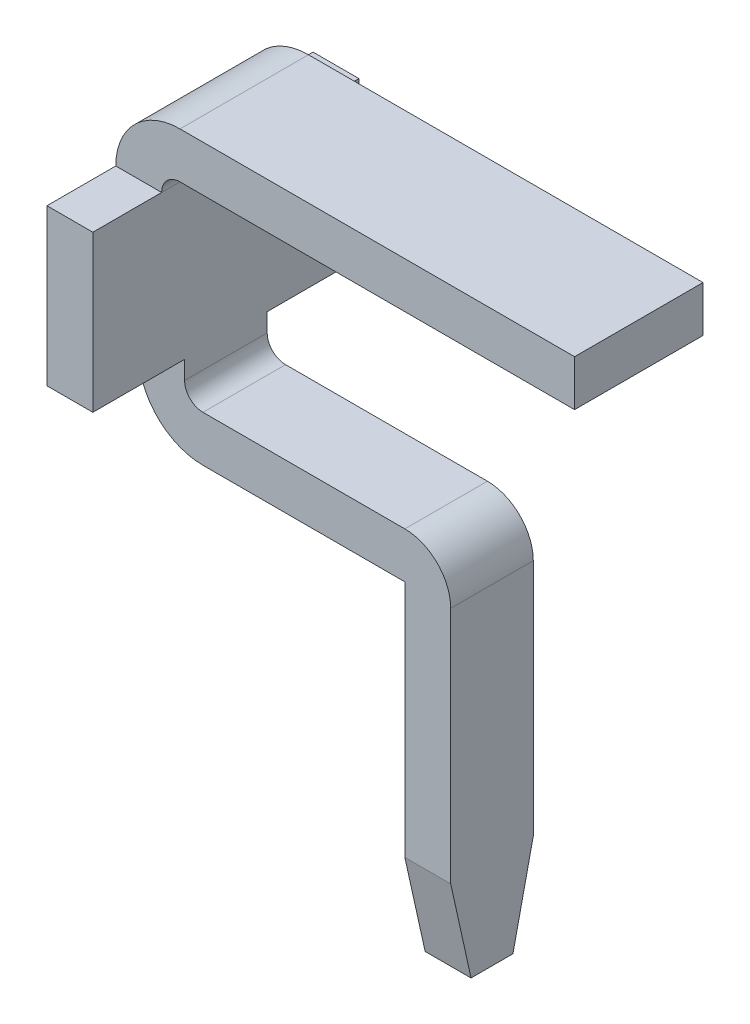
ISO-10303-21;
HEADER;
FILE_DESCRIPTION(('STEP AP214'),'2;1');
FILE_NAME('part.step','',(''),(''),'','','');
FILE_SCHEMA(('AUTOMOTIVE_DESIGN { 1 0 10303 214 1 1 1 1 }'));
ENDSEC;
DATA;
#1=APPLICATION_CONTEXT('core data for automotive mechanical design processes');
#2=APPLICATION_PROTOCOL_DEFINITION('international standard','automotive_design',2000,#1);
#3=PRODUCT_CONTEXT('',#1,'mechanical');
#4=PRODUCT('Part','Part','',(#3));
#5=PRODUCT_RELATED_PRODUCT_CATEGORY('part','',(#4));
#6=PRODUCT_DEFINITION_FORMATION('','',#4);
#7=PRODUCT_DEFINITION_CONTEXT('part definition',#1,'design');
#8=PRODUCT_DEFINITION('design','',#6,#7);
#9=PRODUCT_DEFINITION_SHAPE('','',#8);
#10=(LENGTH_UNIT() NAMED_UNIT(*) SI_UNIT(.MILLI.,.METRE.));
#11=(NAMED_UNIT(*) PLANE_ANGLE_UNIT() SI_UNIT($,.RADIAN.));
#12=(NAMED_UNIT(*) SI_UNIT($,.STERADIAN.) SOLID_ANGLE_UNIT());
#13=UNCERTAINTY_MEASURE_WITH_UNIT(LENGTH_MEASURE(1.E-05),#10,'distance_accuracy_value','');
#14=(GEOMETRIC_REPRESENTATION_CONTEXT(3) GLOBAL_UNCERTAINTY_ASSIGNED_CONTEXT((#13)) GLOBAL_UNIT_ASSIGNED_CONTEXT((#10,
#11,#12)) REPRESENTATION_CONTEXT('',''));
#15=CARTESIAN_POINT('',(0.,0.,0.));
#16=DIRECTION('',(0.,0.,1.));
#17=DIRECTION('',(1.,0.,0.));
#18=AXIS2_PLACEMENT_3D('',#15,#16,#17);
#19=CARTESIAN_POINT('',(17.905055780802,28.974554183552,-0.357117525004));
#20=DIRECTION('',(0.,0.216439613937991,0.976296007119958));
#21=DIRECTION('',(0.,-0.976296007119958,0.216439613937991));
#22=AXIS2_PLACEMENT_3D('',#19,#20,#21);
#23=PLANE('',#22);
#24=DIRECTION('',(1.,0.,0.));
#25=VECTOR('',#24,1.);
#26=CARTESIAN_POINT('',(17.905055780802,27.974554183552,-0.135422862361));
#27=LINE('',#26,#25);
#28=CARTESIAN_POINT('',(15.780053380802,27.974554183552,-0.135422862361));
#29=VERTEX_POINT('',#28);
#30=CARTESIAN_POINT('',(15.280053380802,27.974554183552,-0.135422862361));
#31=VERTEX_POINT('',#30);
#32=EDGE_CURVE('E123',#29,#31,#27,.F.);
#33=ORIENTED_EDGE('',*,*,#32,.T.);
#34=DIRECTION('',(0.,-0.976296007119921,0.216439613938159));
#35=VECTOR('',#34,1.);
#36=CARTESIAN_POINT('',(15.280053380802,28.974554183552,-0.357117525004));
#37=LINE('',#36,#35);
#38=CARTESIAN_POINT('',(15.280053380802,28.974554183552,-0.357117525004));
#39=VERTEX_POINT('',#38);
#40=EDGE_CURVE('E206',#39,#31,#37,.T.);
#41=ORIENTED_EDGE('',*,*,#40,.F.);
#42=DIRECTION('',(1.,0.,0.));
#43=VECTOR('',#42,1.);
#44=CARTESIAN_POINT('',(17.905055780802,28.974554183552,-0.357117525004));
#45=LINE('',#44,#43);
#46=CARTESIAN_POINT('',(15.780053380802,28.974554183552,-0.357117525004));
#47=VERTEX_POINT('',#46);
#48=EDGE_CURVE('E137',#39,#47,#45,.T.);
#49=ORIENTED_EDGE('',*,*,#48,.T.);
#50=DIRECTION('',(0.,0.976296007119921,-0.216439613938159));
#51=VECTOR('',#50,1.);
#52=CARTESIAN_POINT('',(15.780053380802,27.974554183552,-0.135422862361));
#53=LINE('',#52,#51);
#54=EDGE_CURVE('E231',#29,#47,#53,.T.);
#55=ORIENTED_EDGE('',*,*,#54,.F.);
#56=EDGE_LOOP('',(#33,#41,#49,#55));
#57=FACE_BOUND('',#56,.T.);
#58=ADVANCED_FACE('F17',(#57),#23,.F.);
#59=CARTESIAN_POINT('',(17.905055780802,27.974554183552,-0.135422862361));
#60=DIRECTION('',(0.,1.,0.));
#61=DIRECTION('',(0.,0.,1.));
#62=AXIS2_PLACEMENT_3D('',#59,#60,#61);
#63=PLANE('',#62);
#64=DIRECTION('',(1.,0.,0.));
#65=VECTOR('',#64,1.);
#66=CARTESIAN_POINT('',(17.905055780802,27.974554183552,0.321187812353));
#67=LINE('',#66,#65);
#68=CARTESIAN_POINT('',(15.780053380802,27.974554183552,0.321187812353));
#69=VERTEX_POINT('',#68);
#70=CARTESIAN_POINT('',(15.280053380802,27.974554183552,0.321187812353));
#71=VERTEX_POINT('',#70);
#72=EDGE_CURVE('E213',#69,#71,#67,.F.);
#73=ORIENTED_EDGE('',*,*,#72,.T.);
#74=DIRECTION('',(0.,0.,1.));
#75=VECTOR('',#74,1.);
#76=CARTESIAN_POINT('',(15.280053380802,27.974554183552,0.09381247499561));
#77=LINE('',#76,#75);
#78=EDGE_CURVE('E209',#31,#71,#77,.T.);
#79=ORIENTED_EDGE('',*,*,#78,.F.);
#80=ORIENTED_EDGE('',*,*,#32,.F.);
#81=DIRECTION('',(0.,0.,-1.));
#82=VECTOR('',#81,1.);
#83=CARTESIAN_POINT('',(15.780053380802,27.974554183552,0.09381247499561));
#84=LINE('',#83,#82);
#85=EDGE_CURVE('E228',#69,#29,#84,.T.);
#86=ORIENTED_EDGE('',*,*,#85,.F.);
#87=EDGE_LOOP('',(#73,#79,#80,#86));
#88=FACE_BOUND('',#87,.T.);
#89=ADVANCED_FACE('F830',(#88),#63,.F.);
#90=CARTESIAN_POINT('',(17.905055780802,32.074554183552,-0.357117525004));
#91=DIRECTION('',(0.,0.,1.));
#92=DIRECTION('',(0.,-1.,0.));
#93=AXIS2_PLACEMENT_3D('',#90,#91,#92);
#94=PLANE('',#93);
#95=DIRECTION('',(0.,1.,0.));
#96=VECTOR('',#95,1.);
#97=CARTESIAN_POINT('',(15.780053380802,28.974554183552,-0.357117525004));
#98=LINE('',#97,#96);
#99=CARTESIAN_POINT('',(15.780053380802,31.574554183552,-0.357117525004));
#100=VERTEX_POINT('',#99);
#101=EDGE_CURVE('E234',#47,#100,#98,.T.);
#102=ORIENTED_EDGE('',*,*,#101,.F.);
#103=ORIENTED_EDGE('',*,*,#48,.F.);
#104=DIRECTION('',(0.,1.,0.));
#105=VECTOR('',#104,1.);
#106=CARTESIAN_POINT('',(15.280053380802,28.974554183552,-0.357117525004));
#107=LINE('',#106,#105);
#108=CARTESIAN_POINT('',(15.280053380802,31.574554183552,-0.357117525004));
#109=VERTEX_POINT('',#108);
#110=EDGE_CURVE('E398',#109,#39,#107,.F.);
#111=ORIENTED_EDGE('',*,*,#110,.F.);
#112=DIRECTION('',(1.,0.,0.));
#113=VECTOR('',#112,1.);
#114=CARTESIAN_POINT('',(13.080053380802,31.574554183552,-0.357117525004));
#115=LINE('',#114,#113);
#116=CARTESIAN_POINT('',(13.080053380802,31.574554183552,-0.357117525004));
#117=VERTEX_POINT('',#116);
#118=EDGE_CURVE('E388',#117,#109,#115,.T.);
#119=ORIENTED_EDGE('',*,*,#118,.F.);
#120=CARTESIAN_POINT('',(13.080053380802,32.274554183552,-0.357117525004));
#121=DIRECTION('',(0.,0.,-1.));
#122=DIRECTION('',(-1.,0.,0.));
#123=AXIS2_PLACEMENT_3D('',#120,#121,#122);
#124=CIRCLE('',#123,0.7);
#125=CARTESIAN_POINT('',(12.380053380802,32.274554183552,-0.357117525004));
#126=VERTEX_POINT('',#125);
#127=EDGE_CURVE('E140',#126,#117,#124,.F.);
#128=ORIENTED_EDGE('',*,*,#127,.F.);
#129=DIRECTION('',(0.,-1.,0.));
#130=VECTOR('',#129,1.);
#131=CARTESIAN_POINT('',(12.380053380802,32.074554183552,-0.357117525004));
#132=LINE('',#131,#130);
#133=CARTESIAN_POINT('',(12.380053380802,32.474554183552,-0.357117525004));
#134=VERTEX_POINT('',#133);
#135=EDGE_CURVE('E149',#134,#126,#132,.T.);
#136=ORIENTED_EDGE('',*,*,#135,.F.);
#137=DIRECTION('',(1.,0.,0.));
#138=VECTOR('',#137,1.);
#139=CARTESIAN_POINT('',(17.905055780802,32.474554183552,-0.357117525004));
#140=LINE('',#139,#138);
#141=CARTESIAN_POINT('',(12.880053380802,32.474554183552,-0.357117525004));
#142=VERTEX_POINT('',#141);
#143=EDGE_CURVE('E146',#142,#134,#140,.F.);
#144=ORIENTED_EDGE('',*,*,#143,.F.);
#145=DIRECTION('',(0.,-1.,0.));
#146=VECTOR('',#145,1.);
#147=CARTESIAN_POINT('',(12.880053380802,32.074554183552,-0.357117525004));
#148=LINE('',#147,#146);
#149=CARTESIAN_POINT('',(12.880053380802,32.274554183552,-0.357117525004));
#150=VERTEX_POINT('',#149);
#151=EDGE_CURVE('E119',#150,#142,#148,.F.);
#152=ORIENTED_EDGE('',*,*,#151,.F.);
#153=CARTESIAN_POINT('',(13.080053380802,32.274554183552,-0.357117525004));
#154=DIRECTION('',(0.,0.,-1.));
#155=DIRECTION('',(-1.,0.,0.));
#156=AXIS2_PLACEMENT_3D('',#153,#154,#155);
#157=CIRCLE('',#156,0.2);
#158=CARTESIAN_POINT('',(13.080053380802,32.074554183552,-0.357117525004));
#159=VERTEX_POINT('',#158);
#160=EDGE_CURVE('E20',#159,#150,#157,.T.);
#161=ORIENTED_EDGE('',*,*,#160,.F.);
#162=DIRECTION('',(1.,0.,0.));
#163=VECTOR('',#162,1.);
#164=CARTESIAN_POINT('',(13.080053380802,32.074554183552,-0.357117525004));
#165=LINE('',#164,#163);
#166=CARTESIAN_POINT('',(15.280053380802,32.074554183552,-0.357117525004));
#167=VERTEX_POINT('',#166);
#168=EDGE_CURVE('E115',#167,#159,#165,.F.);
#169=ORIENTED_EDGE('',*,*,#168,.F.);
#170=CARTESIAN_POINT('',(15.280053380802,31.574554183552,-0.357117525004));
#171=DIRECTION('',(0.,0.,-1.));
#172=DIRECTION('',(-1.,0.,0.));
#173=AXIS2_PLACEMENT_3D('',#170,#171,#172);
#174=CIRCLE('',#173,0.5);
#175=EDGE_CURVE('E131',#100,#167,#174,.F.);
#176=ORIENTED_EDGE('',*,*,#175,.F.);
#177=EDGE_LOOP('',(#102,#103,#111,#119,#128,#136,#144,#152,#161,#169,#176));
#178=FACE_BOUND('',#177,.T.);
#179=ADVANCED_FACE('F113',(#178),#94,.F.);
#180=CARTESIAN_POINT('',(12.180053380802,33.882322537269,0.0928824749956));
#181=DIRECTION('',(-1.,0.,0.));
#182=DIRECTION('',(0.,-1.,0.));
#183=AXIS2_PLACEMENT_3D('',#180,#181,#182);
#184=PLANE('',#183);
#185=DIRECTION('',(0.,0.,1.));
#186=VECTOR('',#185,1.);
#187=CARTESIAN_POINT('',(12.180053380802,33.674554183552,-0.314471957289));
#188=LINE('',#187,#186);
#189=CARTESIAN_POINT('',(12.180053380802,33.674554183552,-0.406187525004));
#190=VERTEX_POINT('',#189);
#191=CARTESIAN_POINT('',(12.180053380802,33.674554183552,0.593812474996));
#192=VERTEX_POINT('',#191);
#193=EDGE_CURVE('E372',#190,#192,#188,.T.);
#194=ORIENTED_EDGE('',*,*,#193,.F.);
#195=DIRECTION('',(0.,1.,0.));
#196=VECTOR('',#195,1.);
#197=CARTESIAN_POINT('',(12.180053380802,32.974554183552,-0.406187525004));
#198=LINE('',#197,#196);
#199=CARTESIAN_POINT('',(12.180053380802,32.974554183552,-0.406187525004));
#200=VERTEX_POINT('',#199);
#201=EDGE_CURVE('E377',#200,#190,#198,.T.);
#202=ORIENTED_EDGE('',*,*,#201,.F.);
#203=DIRECTION('',(0.,0.,1.));
#204=VECTOR('',#203,1.);
#205=CARTESIAN_POINT('',(12.180053380802,32.974554183552,0.50023690728));
#206=LINE('',#205,#204);
#207=CARTESIAN_POINT('',(12.180053380802,32.974554183552,0.593812474996));
#208=VERTEX_POINT('',#207);
#209=EDGE_CURVE('E382',#208,#200,#206,.F.);
#210=ORIENTED_EDGE('',*,*,#209,.F.);
#211=DIRECTION('',(0.,-1.,0.));
#212=VECTOR('',#211,1.);
#213=CARTESIAN_POINT('',(12.180053380802,33.590090890987,0.593812474996));
#214=LINE('',#213,#212);
#215=EDGE_CURVE('E366',#192,#208,#214,.T.);
#216=ORIENTED_EDGE('',*,*,#215,.F.);
#217=EDGE_LOOP('',(#194,#202,#210,#216));
#218=FACE_BOUND('',#217,.T.);
#219=ADVANCED_FACE('F814',(#218),#184,.T.);
#220=CARTESIAN_POINT('',(13.080053380802,32.074554183552,0.09381247499561));
#221=DIRECTION('',(0.,1.,0.));
#222=DIRECTION('',(0.,0.,1.));
#223=AXIS2_PLACEMENT_3D('',#220,#221,#222);
#224=PLANE('',#223);
#225=ORIENTED_EDGE('',*,*,#168,.T.);
#226=DIRECTION('',(0.,0.,1.));
#227=VECTOR('',#226,1.);
#228=CARTESIAN_POINT('',(13.080053380802,32.074554183552,0.09381247499561));
#229=LINE('',#228,#227);
#230=CARTESIAN_POINT('',(13.080053380802,32.074554183552,0.542882474996));
#231=VERTEX_POINT('',#230);
#232=EDGE_CURVE('E125',#159,#231,#229,.T.);
#233=ORIENTED_EDGE('',*,*,#232,.T.);
#234=DIRECTION('',(1.,0.,0.));
#235=VECTOR('',#234,1.);
#236=CARTESIAN_POINT('',(17.905055780802,32.074554183552,0.542882474996));
#237=LINE('',#236,#235);
#238=CARTESIAN_POINT('',(15.280053380802,32.074554183552,0.542882474996));
#239=VERTEX_POINT('',#238);
#240=EDGE_CURVE('E184',#231,#239,#237,.T.);
#241=ORIENTED_EDGE('',*,*,#240,.T.);
#242=DIRECTION('',(0.,0.,-1.));
#243=VECTOR('',#242,1.);
#244=CARTESIAN_POINT('',(15.280053380802,32.074554183552,0.09381247499561));
#245=LINE('',#244,#243);
#246=EDGE_CURVE('E135',#167,#239,#245,.F.);
#247=ORIENTED_EDGE('',*,*,#246,.F.);
#248=EDGE_LOOP('',(#225,#233,#241,#247));
#249=FACE_BOUND('',#248,.T.);
#250=ADVANCED_FACE('F133',(#249),#224,.T.);
#251=CARTESIAN_POINT('',(15.280053380802,31.574554183552,0.09381247499561));
#252=DIRECTION('',(0.,0.,-1.));
#253=DIRECTION('',(-1.,0.,0.));
#254=AXIS2_PLACEMENT_3D('',#251,#252,#253);
#255=CYLINDRICAL_SURFACE('',#254,0.5);
#256=CARTESIAN_POINT('',(15.280053380802,31.574554183552,0.542882474996));
#257=DIRECTION('',(0.,0.,-1.));
#258=DIRECTION('',(-1.,0.,0.));
#259=AXIS2_PLACEMENT_3D('',#256,#257,#258);
#260=CIRCLE('',#259,0.5);
#261=CARTESIAN_POINT('',(15.780053380802,31.574554183552,0.542882474996));
#262=VERTEX_POINT('',#261);
#263=EDGE_CURVE('E181',#239,#262,#260,.T.);
#264=ORIENTED_EDGE('',*,*,#263,.T.);
#265=DIRECTION('',(0.,0.,-1.));
#266=VECTOR('',#265,1.);
#267=CARTESIAN_POINT('',(15.780053380802,31.574554183552,0.09381247499561));
#268=LINE('',#267,#266);
#269=EDGE_CURVE('E216',#100,#262,#268,.F.);
#270=ORIENTED_EDGE('',*,*,#269,.F.);
#271=ORIENTED_EDGE('',*,*,#175,.T.);
#272=ORIENTED_EDGE('',*,*,#246,.T.);
#273=EDGE_LOOP('',(#264,#270,#271,#272));
#274=FACE_BOUND('',#273,.T.);
#275=ADVANCED_FACE('F419',(#274),#255,.T.);
#276=CARTESIAN_POINT('',(15.780053380802,28.974554183552,0.09381247499561));
#277=DIRECTION('',(1.,0.,0.));
#278=DIRECTION('',(0.,0.,-1.));
#279=AXIS2_PLACEMENT_3D('',#276,#277,#278);
#280=PLANE('',#279);
#281=ORIENTED_EDGE('',*,*,#101,.T.);
#282=ORIENTED_EDGE('',*,*,#269,.T.);
#283=DIRECTION('',(0.,1.,0.));
#284=VECTOR('',#283,1.);
#285=CARTESIAN_POINT('',(15.780053380802,32.074554183552,0.542882474996));
#286=LINE('',#285,#284);
#287=CARTESIAN_POINT('',(15.780053380802,28.974554183552,0.542882474995942));
#288=VERTEX_POINT('',#287);
#289=EDGE_CURVE('E183',#262,#288,#286,.F.);
#290=ORIENTED_EDGE('',*,*,#289,.T.);
#291=DIRECTION('',(0.,0.976296007119958,0.216439613937991));
#292=VECTOR('',#291,1.);
#293=CARTESIAN_POINT('',(15.780053380802,27.974554183552,0.321187812353));
#294=LINE('',#293,#292);
#295=EDGE_CURVE('E210',#288,#69,#294,.F.);
#296=ORIENTED_EDGE('',*,*,#295,.T.);
#297=ORIENTED_EDGE('',*,*,#85,.T.);
#298=ORIENTED_EDGE('',*,*,#54,.T.);
#299=EDGE_LOOP('',(#281,#282,#290,#296,#297,#298));
#300=FACE_BOUND('',#299,.T.);
#301=ADVANCED_FACE('F241',(#300),#280,.T.);
#302=CARTESIAN_POINT('',(17.905055780802,27.974554183552,0.321187812353));
#303=DIRECTION('',(0.,0.216439613937991,-0.976296007119958));
#304=DIRECTION('',(0.,0.976296007119958,0.216439613937991));
#305=AXIS2_PLACEMENT_3D('',#302,#303,#304);
#306=PLANE('',#305);
#307=DIRECTION('',(1.,0.,0.));
#308=VECTOR('',#307,1.);
#309=CARTESIAN_POINT('',(17.905055780802,28.974554183552,0.542882474996));
#310=LINE('',#309,#308);
#311=CARTESIAN_POINT('',(15.280053380802,28.974554183552,0.542882474996));
#312=VERTEX_POINT('',#311);
#313=EDGE_CURVE('E393',#288,#312,#310,.F.);
#314=ORIENTED_EDGE('',*,*,#313,.T.);
#315=DIRECTION('',(0.,0.976296007119921,0.216439613938159));
#316=VECTOR('',#315,1.);
#317=CARTESIAN_POINT('',(15.280053380802,27.974554183552,0.321187812353));
#318=LINE('',#317,#316);
#319=EDGE_CURVE('E221',#71,#312,#318,.T.);
#320=ORIENTED_EDGE('',*,*,#319,.F.);
#321=ORIENTED_EDGE('',*,*,#72,.F.);
#322=ORIENTED_EDGE('',*,*,#295,.F.);
#323=EDGE_LOOP('',(#314,#320,#321,#322));
#324=FACE_BOUND('',#323,.T.);
#325=ADVANCED_FACE('F784',(#324),#306,.F.);
#326=CARTESIAN_POINT('',(15.280053380802,28.974554183552,0.09381247499561));
#327=DIRECTION('',(-1.,0.,0.));
#328=DIRECTION('',(0.,0.,1.));
#329=AXIS2_PLACEMENT_3D('',#326,#327,#328);
#330=PLANE('',#329);
#331=DIRECTION('',(0.,0.,-1.));
#332=VECTOR('',#331,1.);
#333=CARTESIAN_POINT('',(15.280053380802,31.574554183552,0.09381247499561));
#334=LINE('',#333,#332);
#335=CARTESIAN_POINT('',(15.280053380802,31.574554183552,0.542882474996));
#336=VERTEX_POINT('',#335);
#337=EDGE_CURVE('E384',#109,#336,#334,.F.);
#338=ORIENTED_EDGE('',*,*,#337,.F.);
#339=ORIENTED_EDGE('',*,*,#110,.T.);
#340=ORIENTED_EDGE('',*,*,#40,.T.);
#341=ORIENTED_EDGE('',*,*,#78,.T.);
#342=ORIENTED_EDGE('',*,*,#319,.T.);
#343=DIRECTION('',(0.,1.,0.));
#344=VECTOR('',#343,1.);
#345=CARTESIAN_POINT('',(15.280053380802,32.074554183552,0.542882474996));
#346=LINE('',#345,#344);
#347=EDGE_CURVE('E391',#312,#336,#346,.T.);
#348=ORIENTED_EDGE('',*,*,#347,.T.);
#349=EDGE_LOOP('',(#338,#339,#340,#341,#342,#348));
#350=FACE_BOUND('',#349,.T.);
#351=ADVANCED_FACE('F415',(#350),#330,.T.);
#352=CARTESIAN_POINT('',(13.080053380802,31.574554183552,0.09381247499561));
#353=DIRECTION('',(0.,-1.,0.));
#354=DIRECTION('',(0.,0.,-1.));
#355=AXIS2_PLACEMENT_3D('',#352,#353,#354);
#356=PLANE('',#355);
#357=ORIENTED_EDGE('',*,*,#118,.T.);
#358=ORIENTED_EDGE('',*,*,#337,.T.);
#359=DIRECTION('',(1.,0.,0.));
#360=VECTOR('',#359,1.);
#361=CARTESIAN_POINT('',(17.905055780802,31.574554183552,0.542882474996));
#362=LINE('',#361,#360);
#363=CARTESIAN_POINT('',(13.080053380802,31.574554183552,0.542882474996));
#364=VERTEX_POINT('',#363);
#365=EDGE_CURVE('E180',#336,#364,#362,.F.);
#366=ORIENTED_EDGE('',*,*,#365,.T.);
#367=DIRECTION('',(0.,0.,-1.));
#368=VECTOR('',#367,1.);
#369=CARTESIAN_POINT('',(13.080053380802,31.574554183552,0.09381247499561));
#370=LINE('',#369,#368);
#371=EDGE_CURVE('E365',#117,#364,#370,.F.);
#372=ORIENTED_EDGE('',*,*,#371,.F.);
#373=EDGE_LOOP('',(#357,#358,#366,#372));
#374=FACE_BOUND('',#373,.T.);
#375=ADVANCED_FACE('F500',(#374),#356,.T.);
#376=CARTESIAN_POINT('',(12.380053380802,32.974554183552,0.50023690728));
#377=DIRECTION('',(0.,-1.,0.));
#378=DIRECTION('',(1.,0.,0.));
#379=AXIS2_PLACEMENT_3D('',#376,#377,#378);
#380=PLANE('',#379);
#381=ORIENTED_EDGE('',*,*,#209,.T.);
#382=DIRECTION('',(1.,0.,0.));
#383=VECTOR('',#382,1.);
#384=CARTESIAN_POINT('',(12.380053380802,32.974554183552,-0.406187525004));
#385=LINE('',#384,#383);
#386=CARTESIAN_POINT('',(12.380053380802,32.974554183552,-0.406187525004));
#387=VERTEX_POINT('',#386);
#388=EDGE_CURVE('E379',#387,#200,#385,.F.);
#389=ORIENTED_EDGE('',*,*,#388,.F.);
#390=DIRECTION('',(0.,0.,1.));
#391=VECTOR('',#390,1.);
#392=CARTESIAN_POINT('',(12.380053380802,32.974554183552,-0.53799462975));
#393=LINE('',#392,#391);
#394=CARTESIAN_POINT('',(12.380053380802,32.974554183552,0.593812474996));
#395=VERTEX_POINT('',#394);
#396=EDGE_CURVE('E179',#395,#387,#393,.F.);
#397=ORIENTED_EDGE('',*,*,#396,.F.);
#398=DIRECTION('',(1.,0.,0.));
#399=VECTOR('',#398,1.);
#400=CARTESIAN_POINT('',(12.380053380802,32.974554183552,0.593812474996));
#401=LINE('',#400,#399);
#402=EDGE_CURVE('E362',#208,#395,#401,.T.);
#403=ORIENTED_EDGE('',*,*,#402,.F.);
#404=EDGE_LOOP('',(#381,#389,#397,#403));
#405=FACE_BOUND('',#404,.T.);
#406=ADVANCED_FACE('F760',(#405),#380,.T.);
#407=CARTESIAN_POINT('',(12.380053380802,32.974554183552,-0.406187525004));
#408=DIRECTION('',(0.,0.,-1.));
#409=DIRECTION('',(0.,1.,0.));
#410=AXIS2_PLACEMENT_3D('',#407,#408,#409);
#411=PLANE('',#410);
#412=ORIENTED_EDGE('',*,*,#201,.T.);
#413=DIRECTION('',(-1.,0.,0.));
#414=VECTOR('',#413,1.);
#415=CARTESIAN_POINT('',(12.380053380802,33.674554183552,-0.406187525004));
#416=LINE('',#415,#414);
#417=CARTESIAN_POINT('',(12.380053380802,33.674554183552,-0.406187525004));
#418=VERTEX_POINT('',#417);
#419=EDGE_CURVE('E374',#418,#190,#416,.T.);
#420=ORIENTED_EDGE('',*,*,#419,.F.);
#421=DIRECTION('',(0.,1.,0.));
#422=VECTOR('',#421,1.);
#423=CARTESIAN_POINT('',(12.380053380802,34.036716877935,-0.406187525004));
#424=LINE('',#423,#422);
#425=EDGE_CURVE('E476',#387,#418,#424,.T.);
#426=ORIENTED_EDGE('',*,*,#425,.F.);
#427=ORIENTED_EDGE('',*,*,#388,.T.);
#428=EDGE_LOOP('',(#412,#420,#426,#427));
#429=FACE_BOUND('',#428,.T.);
#430=ADVANCED_FACE('F751',(#429),#411,.T.);
#431=CARTESIAN_POINT('',(12.380053380802,33.674554183552,-0.314471957289));
#432=DIRECTION('',(0.,1.,0.));
#433=DIRECTION('',(-1.,0.,0.));
#434=AXIS2_PLACEMENT_3D('',#431,#432,#433);
#435=PLANE('',#434);
#436=ORIENTED_EDGE('',*,*,#193,.T.);
#437=DIRECTION('',(1.,0.,0.));
#438=VECTOR('',#437,1.);
#439=CARTESIAN_POINT('',(12.380053380802,33.674554183552,0.593812474996));
#440=LINE('',#439,#438);
#441=CARTESIAN_POINT('',(12.380053380802,33.674554183552,0.593812474996));
#442=VERTEX_POINT('',#441);
#443=EDGE_CURVE('E369',#442,#192,#440,.F.);
#444=ORIENTED_EDGE('',*,*,#443,.F.);
#445=DIRECTION('',(0.,0.,1.));
#446=VECTOR('',#445,1.);
#447=CARTESIAN_POINT('',(12.380053380802,33.674554183552,-0.53799462975));
#448=LINE('',#447,#446);
#449=EDGE_CURVE('E473',#418,#442,#448,.T.);
#450=ORIENTED_EDGE('',*,*,#449,.F.);
#451=ORIENTED_EDGE('',*,*,#419,.T.);
#452=EDGE_LOOP('',(#436,#444,#450,#451));
#453=FACE_BOUND('',#452,.T.);
#454=ADVANCED_FACE('F742',(#453),#435,.T.);
#455=CARTESIAN_POINT('',(12.380053380802,33.590090890987,0.593812474996));
#456=DIRECTION('',(0.,0.,1.));
#457=DIRECTION('',(0.,-1.,0.));
#458=AXIS2_PLACEMENT_3D('',#455,#456,#457);
#459=PLANE('',#458);
#460=ORIENTED_EDGE('',*,*,#215,.T.);
#461=ORIENTED_EDGE('',*,*,#402,.T.);
#462=DIRECTION('',(0.,1.,0.));
#463=VECTOR('',#462,1.);
#464=CARTESIAN_POINT('',(12.380053380802,34.036716877935,0.593812474996));
#465=LINE('',#464,#463);
#466=EDGE_CURVE('E361',#442,#395,#465,.F.);
#467=ORIENTED_EDGE('',*,*,#466,.F.);
#468=ORIENTED_EDGE('',*,*,#443,.T.);
#469=EDGE_LOOP('',(#460,#461,#467,#468));
#470=FACE_BOUND('',#469,.T.);
#471=ADVANCED_FACE('F734',(#470),#459,.T.);
#472=CARTESIAN_POINT('',(13.080053380802,32.274554183552,0.09381247499561));
#473=DIRECTION('',(0.,0.,-1.));
#474=DIRECTION('',(-1.,0.,0.));
#475=AXIS2_PLACEMENT_3D('',#472,#473,#474);
#476=CYLINDRICAL_SURFACE('',#475,0.7);
#477=CARTESIAN_POINT('',(13.080053380802,32.274554183552,0.542882474996));
#478=DIRECTION('',(0.,0.,-1.));
#479=DIRECTION('',(-1.,0.,0.));
#480=AXIS2_PLACEMENT_3D('',#477,#478,#479);
#481=CIRCLE('',#480,0.7);
#482=CARTESIAN_POINT('',(12.380053380802,32.274554183552,0.542882474996));
#483=VERTEX_POINT('',#482);
#484=EDGE_CURVE('E177',#364,#483,#481,.T.);
#485=ORIENTED_EDGE('',*,*,#484,.T.);
#486=DIRECTION('',(0.,0.,1.));
#487=VECTOR('',#486,1.);
#488=CARTESIAN_POINT('',(12.380053380802,32.274554183552,-0.53799462975));
#489=LINE('',#488,#487);
#490=EDGE_CURVE('E359',#126,#483,#489,.T.);
#491=ORIENTED_EDGE('',*,*,#490,.F.);
#492=ORIENTED_EDGE('',*,*,#127,.T.);
#493=ORIENTED_EDGE('',*,*,#371,.T.);
#494=EDGE_LOOP('',(#485,#491,#492,#493));
#495=FACE_BOUND('',#494,.T.);
#496=ADVANCED_FACE('F501',(#495),#476,.T.);
#497=CARTESIAN_POINT('',(17.905055780802,32.074554183552,0.542882474996));
#498=DIRECTION('',(0.,0.,-1.));
#499=DIRECTION('',(0.,1.,0.));
#500=AXIS2_PLACEMENT_3D('',#497,#498,#499);
#501=PLANE('',#500);
#502=ORIENTED_EDGE('',*,*,#484,.F.);
#503=ORIENTED_EDGE('',*,*,#365,.F.);
#504=ORIENTED_EDGE('',*,*,#347,.F.);
#505=ORIENTED_EDGE('',*,*,#313,.F.);
#506=ORIENTED_EDGE('',*,*,#289,.F.);
#507=ORIENTED_EDGE('',*,*,#263,.F.);
#508=ORIENTED_EDGE('',*,*,#240,.F.);
#509=CARTESIAN_POINT('',(13.080053380802,32.274554183552,0.542882474996));
#510=DIRECTION('',(0.,0.,-1.));
#511=DIRECTION('',(-1.,0.,0.));
#512=AXIS2_PLACEMENT_3D('',#509,#510,#511);
#513=CIRCLE('',#512,0.2);
#514=CARTESIAN_POINT('',(12.880053380802,32.274554183552,0.542882474996));
#515=VERTEX_POINT('',#514);
#516=EDGE_CURVE('E128',#231,#515,#513,.T.);
#517=ORIENTED_EDGE('',*,*,#516,.T.);
#518=DIRECTION('',(0.,1.,0.));
#519=VECTOR('',#518,1.);
#520=CARTESIAN_POINT('',(12.880053380802,32.074554183552,0.542882474996));
#521=LINE('',#520,#519);
#522=CARTESIAN_POINT('',(12.880053380802,32.474554183552,0.542882474996));
#523=VERTEX_POINT('',#522);
#524=EDGE_CURVE('E347',#523,#515,#521,.F.);
#525=ORIENTED_EDGE('',*,*,#524,.F.);
#526=DIRECTION('',(1.,0.,0.));
#527=VECTOR('',#526,1.);
#528=CARTESIAN_POINT('',(12.380053380802,32.474554183552,0.542882474996));
#529=LINE('',#528,#527);
#530=CARTESIAN_POINT('',(12.380053380802,32.474554183552,0.542882474996));
#531=VERTEX_POINT('',#530);
#532=EDGE_CURVE('E175',#531,#523,#529,.T.);
#533=ORIENTED_EDGE('',*,*,#532,.F.);
#534=DIRECTION('',(0.,1.,0.));
#535=VECTOR('',#534,1.);
#536=CARTESIAN_POINT('',(12.380053380802,34.036716877935,0.542882474996));
#537=LINE('',#536,#535);
#538=EDGE_CURVE('E176',#483,#531,#537,.T.);
#539=ORIENTED_EDGE('',*,*,#538,.F.);
#540=EDGE_LOOP('',(#502,#503,#504,#505,#506,#507,#508,#517,#525,#533,#539));
#541=FACE_BOUND('',#540,.T.);
#542=ADVANCED_FACE('F426',(#541),#501,.F.);
#543=CARTESIAN_POINT('',(12.380053380802,34.036716877935,-0.53799462975));
#544=DIRECTION('',(-1.,0.,0.));
#545=DIRECTION('',(0.,0.,1.));
#546=AXIS2_PLACEMENT_3D('',#543,#544,#545);
#547=PLANE('',#546);
#548=DIRECTION('',(0.,0.,1.));
#549=VECTOR('',#548,1.);
#550=CARTESIAN_POINT('',(12.380053380802,34.174554183552,1.042882474996));
#551=LINE('',#550,#549);
#552=CARTESIAN_POINT('',(12.380053380802,34.174554183552,-1.357117525004));
#553=VERTEX_POINT('',#552);
#554=CARTESIAN_POINT('',(12.380053380802,34.174554183552,-0.607117525004));
#555=VERTEX_POINT('',#554);
#556=EDGE_CURVE('E506',#553,#555,#551,.T.);
#557=ORIENTED_EDGE('',*,*,#556,.F.);
#558=DIRECTION('',(0.,1.,0.));
#559=VECTOR('',#558,1.);
#560=CARTESIAN_POINT('',(12.380053380802,33.674554183552,-1.357117525004));
#561=LINE('',#560,#559);
#562=CARTESIAN_POINT('',(12.380053380802,32.474554183552,-1.357117525004));
#563=VERTEX_POINT('',#562);
#564=EDGE_CURVE('E463',#563,#553,#561,.T.);
#565=ORIENTED_EDGE('',*,*,#564,.F.);
#566=DIRECTION('',(0.,0.,-1.));
#567=VECTOR('',#566,1.);
#568=CARTESIAN_POINT('',(12.380053380802,32.474554183552,-1.357117525004));
#569=LINE('',#568,#567);
#570=EDGE_CURVE('E342',#134,#563,#569,.T.);
#571=ORIENTED_EDGE('',*,*,#570,.F.);
#572=ORIENTED_EDGE('',*,*,#135,.T.);
#573=ORIENTED_EDGE('',*,*,#490,.T.);
#574=ORIENTED_EDGE('',*,*,#538,.T.);
#575=DIRECTION('',(0.,0.,-1.));
#576=VECTOR('',#575,1.);
#577=CARTESIAN_POINT('',(12.380053380802,32.474554183552,-1.357117525004));
#578=LINE('',#577,#576);
#579=CARTESIAN_POINT('',(12.380053380802,32.474554183552,1.542882474996));
#580=VERTEX_POINT('',#579);
#581=EDGE_CURVE('E443',#580,#531,#578,.T.);
#582=ORIENTED_EDGE('',*,*,#581,.F.);
#583=DIRECTION('',(0.,-1.,0.));
#584=VECTOR('',#583,1.);
#585=CARTESIAN_POINT('',(12.380053380802,32.474554183552,1.542882474996));
#586=LINE('',#585,#584);
#587=CARTESIAN_POINT('',(12.380053380802,34.174554183552,1.542882474996));
#588=VERTEX_POINT('',#587);
#589=EDGE_CURVE('E464',#588,#580,#586,.T.);
#590=ORIENTED_EDGE('',*,*,#589,.F.);
#591=DIRECTION('',(0.,0.,1.));
#592=VECTOR('',#591,1.);
#593=CARTESIAN_POINT('',(12.380053380802,34.174554183552,1.042882474996));
#594=LINE('',#593,#592);
#595=CARTESIAN_POINT('',(12.380053380802,34.174554183552,0.792882474996));
#596=VERTEX_POINT('',#595);
#597=EDGE_CURVE('E510',#596,#588,#594,.T.);
#598=ORIENTED_EDGE('',*,*,#597,.F.);
#599=DIRECTION('',(0.,0.,-1.));
#600=VECTOR('',#599,1.);
#601=CARTESIAN_POINT('',(12.380053380802,34.174554183552,0.09381247499561));
#602=LINE('',#601,#600);
#603=EDGE_CURVE('E353',#555,#596,#602,.F.);
#604=ORIENTED_EDGE('',*,*,#603,.F.);
#605=EDGE_LOOP('',(#557,#565,#571,#572,#573,#574,#582,#590,#598,#604));
#606=FACE_BOUND('',#605,.T.);
#607=ORIENTED_EDGE('',*,*,#449,.T.);
#608=ORIENTED_EDGE('',*,*,#466,.T.);
#609=ORIENTED_EDGE('',*,*,#396,.T.);
#610=ORIENTED_EDGE('',*,*,#425,.T.);
#611=EDGE_LOOP('',(#607,#608,#609,#610));
#612=FACE_BOUND('',#611,.T.);
#613=ADVANCED_FACE('F503',(#606,#612),#547,.T.);
#614=CARTESIAN_POINT('',(13.080053380802,32.274554183552,0.09381247499561));
#615=DIRECTION('',(0.,0.,-1.));
#616=DIRECTION('',(-1.,0.,0.));
#617=AXIS2_PLACEMENT_3D('',#614,#615,#616);
#618=CYLINDRICAL_SURFACE('',#617,0.2);
#619=DIRECTION('',(0.,0.,1.));
#620=VECTOR('',#619,1.);
#621=CARTESIAN_POINT('',(12.880053380802,32.274554183552,-0.53799462975));
#622=LINE('',#621,#620);
#623=EDGE_CURVE('E345',#150,#515,#622,.T.);
#624=ORIENTED_EDGE('',*,*,#623,.T.);
#625=ORIENTED_EDGE('',*,*,#516,.F.);
#626=ORIENTED_EDGE('',*,*,#232,.F.);
#627=ORIENTED_EDGE('',*,*,#160,.T.);
#628=EDGE_LOOP('',(#624,#625,#626,#627));
#629=FACE_BOUND('',#628,.T.);
#630=ADVANCED_FACE('F126',(#629),#618,.F.);
#631=CARTESIAN_POINT('',(12.380053380802,32.474554183552,-1.357117525004));
#632=DIRECTION('',(0.,-1.,0.));
#633=DIRECTION('',(0.,0.,-1.));
#634=AXIS2_PLACEMENT_3D('',#631,#632,#633);
#635=PLANE('',#634);
#636=DIRECTION('',(1.,0.,0.));
#637=VECTOR('',#636,1.);
#638=CARTESIAN_POINT('',(12.380053380802,32.474554183552,1.542882474996));
#639=LINE('',#638,#637);
#640=CARTESIAN_POINT('',(12.880053380802,32.474554183552,1.542882474996));
#641=VERTEX_POINT('',#640);
#642=EDGE_CURVE('E461',#580,#641,#639,.T.);
#643=ORIENTED_EDGE('',*,*,#642,.F.);
#644=ORIENTED_EDGE('',*,*,#581,.T.);
#645=ORIENTED_EDGE('',*,*,#532,.T.);
#646=DIRECTION('',(0.,0.,1.));
#647=VECTOR('',#646,1.);
#648=CARTESIAN_POINT('',(12.880053380802,32.474554183552,-0.53799462975));
#649=LINE('',#648,#647);
#650=EDGE_CURVE('E348',#523,#641,#649,.T.);
#651=ORIENTED_EDGE('',*,*,#650,.T.);
#652=EDGE_LOOP('',(#643,#644,#645,#651));
#653=FACE_BOUND('',#652,.T.);
#654=ADVANCED_FACE('F441',(#653),#635,.T.);
#655=CARTESIAN_POINT('',(12.380053380802,32.474554183552,1.542882474996));
#656=DIRECTION('',(0.,0.,1.));
#657=DIRECTION('',(0.,-1.,0.));
#658=AXIS2_PLACEMENT_3D('',#655,#656,#657);
#659=PLANE('',#658);
#660=DIRECTION('',(0.,1.,0.));
#661=VECTOR('',#660,1.);
#662=CARTESIAN_POINT('',(12.880053380802,34.036716877935,1.542882474996));
#663=LINE('',#662,#661);
#664=CARTESIAN_POINT('',(12.880053380802,34.174554183552,1.542882474996));
#665=VERTEX_POINT('',#664);
#666=EDGE_CURVE('E351',#641,#665,#663,.T.);
#667=ORIENTED_EDGE('',*,*,#666,.T.);
#668=DIRECTION('',(1.,0.,0.));
#669=VECTOR('',#668,1.);
#670=CARTESIAN_POINT('',(12.380053380802,34.174554183552,1.542882474996));
#671=LINE('',#670,#669);
#672=EDGE_CURVE('E520',#588,#665,#671,.T.);
#673=ORIENTED_EDGE('',*,*,#672,.F.);
#674=ORIENTED_EDGE('',*,*,#589,.T.);
#675=ORIENTED_EDGE('',*,*,#642,.T.);
#676=EDGE_LOOP('',(#667,#673,#674,#675));
#677=FACE_BOUND('',#676,.T.);
#678=ADVANCED_FACE('F691',(#677),#659,.T.);
#679=CARTESIAN_POINT('',(12.380053380802,33.674554183552,-1.357117525004));
#680=DIRECTION('',(0.,0.,-1.));
#681=DIRECTION('',(0.,1.,0.));
#682=AXIS2_PLACEMENT_3D('',#679,#680,#681);
#683=PLANE('',#682);
#684=DIRECTION('',(0.,1.,0.));
#685=VECTOR('',#684,1.);
#686=CARTESIAN_POINT('',(12.880053380802,34.036716877935,-1.357117525004));
#687=LINE('',#686,#685);
#688=CARTESIAN_POINT('',(12.880053380802,34.174554183552,-1.357117525004));
#689=VERTEX_POINT('',#688);
#690=CARTESIAN_POINT('',(12.880053380802,32.474554183552,-1.357117525004));
#691=VERTEX_POINT('',#690);
#692=EDGE_CURVE('E156',#689,#691,#687,.F.);
#693=ORIENTED_EDGE('',*,*,#692,.T.);
#694=DIRECTION('',(1.,0.,0.));
#695=VECTOR('',#694,1.);
#696=CARTESIAN_POINT('',(12.380053380802,32.474554183552,-1.357117525004));
#697=LINE('',#696,#695);
#698=EDGE_CURVE('E330',#563,#691,#697,.T.);
#699=ORIENTED_EDGE('',*,*,#698,.F.);
#700=ORIENTED_EDGE('',*,*,#564,.T.);
#701=DIRECTION('',(1.,0.,0.));
#702=VECTOR('',#701,1.);
#703=CARTESIAN_POINT('',(12.380053380802,34.174554183552,-1.357117525004));
#704=LINE('',#703,#702);
#705=EDGE_CURVE('E333',#689,#553,#704,.F.);
#706=ORIENTED_EDGE('',*,*,#705,.F.);
#707=EDGE_LOOP('',(#693,#699,#700,#706));
#708=FACE_BOUND('',#707,.T.);
#709=ADVANCED_FACE('F329',(#708),#683,.T.);
#710=CARTESIAN_POINT('',(12.380053380802,32.474554183552,-1.357117525004));
#711=DIRECTION('',(0.,-1.,0.));
#712=DIRECTION('',(0.,0.,-1.));
#713=AXIS2_PLACEMENT_3D('',#710,#711,#712);
#714=PLANE('',#713);
#715=ORIENTED_EDGE('',*,*,#570,.T.);
#716=ORIENTED_EDGE('',*,*,#698,.T.);
#717=DIRECTION('',(0.,0.,1.));
#718=VECTOR('',#717,1.);
#719=CARTESIAN_POINT('',(12.880053380802,32.474554183552,-0.53799462975));
#720=LINE('',#719,#718);
#721=EDGE_CURVE('E152',#691,#142,#720,.T.);
#722=ORIENTED_EDGE('',*,*,#721,.T.);
#723=ORIENTED_EDGE('',*,*,#143,.T.);
#724=EDGE_LOOP('',(#715,#716,#722,#723));
#725=FACE_BOUND('',#724,.T.);
#726=ADVANCED_FACE('F341',(#725),#714,.T.);
#727=CARTESIAN_POINT('',(12.380053380802,34.174554183552,1.042882474996));
#728=DIRECTION('',(0.,1.,0.));
#729=DIRECTION('',(0.,0.,1.));
#730=AXIS2_PLACEMENT_3D('',#727,#728,#729);
#731=PLANE('',#730);
#732=ORIENTED_EDGE('',*,*,#705,.T.);
#733=ORIENTED_EDGE('',*,*,#556,.T.);
#734=DIRECTION('',(1.,0.,0.));
#735=VECTOR('',#734,1.);
#736=CARTESIAN_POINT('',(17.905055780802,34.174554183552,-0.607117525004));
#737=LINE('',#736,#735);
#738=CARTESIAN_POINT('',(12.880053380802,34.174554183552,-0.607117525004));
#739=VERTEX_POINT('',#738);
#740=EDGE_CURVE('E173',#555,#739,#737,.T.);
#741=ORIENTED_EDGE('',*,*,#740,.T.);
#742=DIRECTION('',(0.,0.,1.));
#743=VECTOR('',#742,1.);
#744=CARTESIAN_POINT('',(12.880053380802,34.174554183552,-0.53799462975));
#745=LINE('',#744,#743);
#746=EDGE_CURVE('E338',#739,#689,#745,.F.);
#747=ORIENTED_EDGE('',*,*,#746,.T.);
#748=EDGE_LOOP('',(#732,#733,#741,#747));
#749=FACE_BOUND('',#748,.T.);
#750=ADVANCED_FACE('F512',(#749),#731,.T.);
#751=CARTESIAN_POINT('',(12.380053380802,34.174554183552,1.042882474996));
#752=DIRECTION('',(0.,1.,0.));
#753=DIRECTION('',(0.,0.,1.));
#754=AXIS2_PLACEMENT_3D('',#751,#752,#753);
#755=PLANE('',#754);
#756=DIRECTION('',(0.,0.,1.));
#757=VECTOR('',#756,1.);
#758=CARTESIAN_POINT('',(12.880053380802,34.174554183552,-0.53799462975));
#759=LINE('',#758,#757);
#760=CARTESIAN_POINT('',(12.880053380802,34.174554183552,0.792882474996));
#761=VERTEX_POINT('',#760);
#762=EDGE_CURVE('E449',#665,#761,#759,.F.);
#763=ORIENTED_EDGE('',*,*,#762,.T.);
#764=DIRECTION('',(1.,0.,0.));
#765=VECTOR('',#764,1.);
#766=CARTESIAN_POINT('',(16.247189250815,34.174554183552,0.792882474996));
#767=LINE('',#766,#765);
#768=EDGE_CURVE('E169',#761,#596,#767,.F.);
#769=ORIENTED_EDGE('',*,*,#768,.T.);
#770=ORIENTED_EDGE('',*,*,#597,.T.);
#771=ORIENTED_EDGE('',*,*,#672,.T.);
#772=EDGE_LOOP('',(#763,#769,#770,#771));
#773=FACE_BOUND('',#772,.T.);
#774=ADVANCED_FACE('F588',(#773),#755,.T.);
#775=CARTESIAN_POINT('',(13.080053380802,34.174554183552,0.09381247499561));
#776=DIRECTION('',(0.,0.,-1.));
#777=DIRECTION('',(-1.,0.,0.));
#778=AXIS2_PLACEMENT_3D('',#775,#776,#777);
#779=CYLINDRICAL_SURFACE('',#778,0.7);
#780=CARTESIAN_POINT('',(13.080053380802,34.174554183552,0.792882474996));
#781=DIRECTION('',(0.,0.,-1.));
#782=DIRECTION('',(-1.,0.,0.));
#783=AXIS2_PLACEMENT_3D('',#780,#781,#782);
#784=CIRCLE('',#783,0.7);
#785=CARTESIAN_POINT('',(13.080053380802,34.874554183552,0.792882474996));
#786=VERTEX_POINT('',#785);
#787=EDGE_CURVE('E166',#596,#786,#784,.T.);
#788=ORIENTED_EDGE('',*,*,#787,.T.);
#789=DIRECTION('',(0.,0.,-1.));
#790=VECTOR('',#789,1.);
#791=CARTESIAN_POINT('',(13.080053380802,34.874554183552,0.792882474996));
#792=LINE('',#791,#790);
#793=CARTESIAN_POINT('',(13.080053380802,34.874554183552,-0.607117525004));
#794=VERTEX_POINT('',#793);
#795=EDGE_CURVE('E349',#786,#794,#792,.T.);
#796=ORIENTED_EDGE('',*,*,#795,.T.);
#797=CARTESIAN_POINT('',(13.080053380802,34.174554183552,-0.607117525004));
#798=DIRECTION('',(0.,0.,-1.));
#799=DIRECTION('',(-1.,0.,0.));
#800=AXIS2_PLACEMENT_3D('',#797,#798,#799);
#801=CIRCLE('',#800,0.7);
#802=EDGE_CURVE('E170',#794,#555,#801,.F.);
#803=ORIENTED_EDGE('',*,*,#802,.T.);
#804=ORIENTED_EDGE('',*,*,#603,.T.);
#805=EDGE_LOOP('',(#788,#796,#803,#804));
#806=FACE_BOUND('',#805,.T.);
#807=ADVANCED_FACE('F590',(#806),#779,.T.);
#808=CARTESIAN_POINT('',(17.905055780802,34.874554183552,0.792882474996));
#809=DIRECTION('',(0.,-1.,0.));
#810=DIRECTION('',(0.,0.,-1.));
#811=AXIS2_PLACEMENT_3D('',#808,#809,#810);
#812=PLANE('',#811);
#813=DIRECTION('',(1.,0.,0.));
#814=VECTOR('',#813,1.);
#815=CARTESIAN_POINT('',(16.247189250815,34.874554183552,0.792882474996));
#816=LINE('',#815,#814);
#817=CARTESIAN_POINT('',(17.380053380802,34.874554183552,0.792882474996));
#818=VERTEX_POINT('',#817);
#819=EDGE_CURVE('E168',#786,#818,#816,.T.);
#820=ORIENTED_EDGE('',*,*,#819,.T.);
#821=DIRECTION('',(0.,0.,1.));
#822=VECTOR('',#821,1.);
#823=CARTESIAN_POINT('',(17.380053380802,34.874554183552,-0.157117525004));
#824=LINE('',#823,#822);
#825=CARTESIAN_POINT('',(17.380053380802,34.874554183552,-0.607117525004));
#826=VERTEX_POINT('',#825);
#827=EDGE_CURVE('E531',#818,#826,#824,.F.);
#828=ORIENTED_EDGE('',*,*,#827,.T.);
#829=DIRECTION('',(1.,0.,0.));
#830=VECTOR('',#829,1.);
#831=CARTESIAN_POINT('',(17.905055780802,34.874554183552,-0.607117525004));
#832=LINE('',#831,#830);
#833=EDGE_CURVE('E155',#826,#794,#832,.F.);
#834=ORIENTED_EDGE('',*,*,#833,.T.);
#835=ORIENTED_EDGE('',*,*,#795,.F.);
#836=EDGE_LOOP('',(#820,#828,#834,#835));
#837=FACE_BOUND('',#836,.T.);
#838=ADVANCED_FACE('F571',(#837),#812,.F.);
#839=CARTESIAN_POINT('',(12.880053380802,34.036716877935,-0.53799462975));
#840=DIRECTION('',(-1.,0.,0.));
#841=DIRECTION('',(0.,0.,1.));
#842=AXIS2_PLACEMENT_3D('',#839,#840,#841);
#843=PLANE('',#842);
#844=ORIENTED_EDGE('',*,*,#692,.F.);
#845=ORIENTED_EDGE('',*,*,#746,.F.);
#846=DIRECTION('',(0.,0.,-1.));
#847=VECTOR('',#846,1.);
#848=CARTESIAN_POINT('',(12.880053380802,34.174554183552,0.09381247499561));
#849=LINE('',#848,#847);
#850=EDGE_CURVE('E161',#739,#761,#849,.F.);
#851=ORIENTED_EDGE('',*,*,#850,.T.);
#852=ORIENTED_EDGE('',*,*,#762,.F.);
#853=ORIENTED_EDGE('',*,*,#666,.F.);
#854=ORIENTED_EDGE('',*,*,#650,.F.);
#855=ORIENTED_EDGE('',*,*,#524,.T.);
#856=ORIENTED_EDGE('',*,*,#623,.F.);
#857=ORIENTED_EDGE('',*,*,#151,.T.);
#858=ORIENTED_EDGE('',*,*,#721,.F.);
#859=EDGE_LOOP('',(#844,#845,#851,#852,#853,#854,#855,#856,#857,#858));
#860=FACE_BOUND('',#859,.T.);
#861=ADVANCED_FACE('F344',(#860),#843,.F.);
#862=CARTESIAN_POINT('',(17.905055780802,34.874554183552,-0.607117525004));
#863=DIRECTION('',(0.,0.,1.));
#864=DIRECTION('',(0.,-1.,0.));
#865=AXIS2_PLACEMENT_3D('',#862,#863,#864);
#866=PLANE('',#865);
#867=DIRECTION('',(1.,0.,0.));
#868=VECTOR('',#867,1.);
#869=CARTESIAN_POINT('',(16.860438138531,34.374554183552,-0.607117525004));
#870=LINE('',#869,#868);
#871=CARTESIAN_POINT('',(13.080053380802,34.374554183552,-0.607117525004));
#872=VERTEX_POINT('',#871);
#873=CARTESIAN_POINT('',(17.380053380802,34.374554183552,-0.607117525004));
#874=VERTEX_POINT('',#873);
#875=EDGE_CURVE('E160',#872,#874,#870,.T.);
#876=ORIENTED_EDGE('',*,*,#875,.F.);
#877=CARTESIAN_POINT('',(13.080053380802,34.174554183552,-0.607117525004));
#878=DIRECTION('',(0.,0.,-1.));
#879=DIRECTION('',(-1.,0.,0.));
#880=AXIS2_PLACEMENT_3D('',#877,#878,#879);
#881=CIRCLE('',#880,0.2);
#882=EDGE_CURVE('E162',#872,#739,#881,.F.);
#883=ORIENTED_EDGE('',*,*,#882,.T.);
#884=ORIENTED_EDGE('',*,*,#740,.F.);
#885=ORIENTED_EDGE('',*,*,#802,.F.);
#886=ORIENTED_EDGE('',*,*,#833,.F.);
#887=DIRECTION('',(0.,1.,0.));
#888=VECTOR('',#887,1.);
#889=CARTESIAN_POINT('',(17.380053380802,27.284551783552,-0.607117525004));
#890=LINE('',#889,#888);
#891=EDGE_CURVE('E533',#826,#874,#890,.F.);
#892=ORIENTED_EDGE('',*,*,#891,.T.);
#893=EDGE_LOOP('',(#876,#883,#884,#885,#886,#892));
#894=FACE_BOUND('',#893,.T.);
#895=ADVANCED_FACE('F584',(#894),#866,.F.);
#896=CARTESIAN_POINT('',(17.380053380802,27.284551783552,-0.157117525004));
#897=DIRECTION('',(-1.,0.,0.));
#898=DIRECTION('',(0.,0.,1.));
#899=AXIS2_PLACEMENT_3D('',#896,#897,#898);
#900=PLANE('',#899);
#901=ORIENTED_EDGE('',*,*,#827,.F.);
#902=DIRECTION('',(0.,1.,0.));
#903=VECTOR('',#902,1.);
#904=CARTESIAN_POINT('',(17.380053380802,27.284551783552,0.792882474996));
#905=LINE('',#904,#903);
#906=CARTESIAN_POINT('',(17.380053380802,34.374554183552,0.792882474996));
#907=VERTEX_POINT('',#906);
#908=EDGE_CURVE('E165',#818,#907,#905,.F.);
#909=ORIENTED_EDGE('',*,*,#908,.T.);
#910=DIRECTION('',(0.,0.,-1.));
#911=VECTOR('',#910,1.);
#912=CARTESIAN_POINT('',(17.380053380802,34.374554183552,0.09381247499561));
#913=LINE('',#912,#911);
#914=EDGE_CURVE('E549',#874,#907,#913,.F.);
#915=ORIENTED_EDGE('',*,*,#914,.F.);
#916=ORIENTED_EDGE('',*,*,#891,.F.);
#917=EDGE_LOOP('',(#901,#909,#915,#916));
#918=FACE_BOUND('',#917,.T.);
#919=ADVANCED_FACE('F577',(#918),#900,.F.);
#920=CARTESIAN_POINT('',(16.247189250815,27.284551783552,0.792882474996));
#921=DIRECTION('',(0.,0.,-1.));
#922=DIRECTION('',(0.,1.,0.));
#923=AXIS2_PLACEMENT_3D('',#920,#921,#922);
#924=PLANE('',#923);
#925=ORIENTED_EDGE('',*,*,#819,.F.);
#926=ORIENTED_EDGE('',*,*,#787,.F.);
#927=ORIENTED_EDGE('',*,*,#768,.F.);
#928=CARTESIAN_POINT('',(13.080053380802,34.174554183552,0.792882474996));
#929=DIRECTION('',(0.,0.,-1.));
#930=DIRECTION('',(-1.,0.,0.));
#931=AXIS2_PLACEMENT_3D('',#928,#929,#930);
#932=CIRCLE('',#931,0.2);
#933=CARTESIAN_POINT('',(13.080053380802,34.374554183552,0.792882474996));
#934=VERTEX_POINT('',#933);
#935=EDGE_CURVE('E35',#761,#934,#932,.T.);
#936=ORIENTED_EDGE('',*,*,#935,.T.);
#937=DIRECTION('',(1.,0.,0.));
#938=VECTOR('',#937,1.);
#939=CARTESIAN_POINT('',(16.860438138531,34.374554183552,0.792882474996));
#940=LINE('',#939,#938);
#941=EDGE_CURVE('E26',#907,#934,#940,.F.);
#942=ORIENTED_EDGE('',*,*,#941,.F.);
#943=ORIENTED_EDGE('',*,*,#908,.F.);
#944=EDGE_LOOP('',(#925,#926,#927,#936,#942,#943));
#945=FACE_BOUND('',#944,.T.);
#946=ADVANCED_FACE('F579',(#945),#924,.F.);
#947=CARTESIAN_POINT('',(13.080053380802,34.174554183552,0.09381247499561));
#948=DIRECTION('',(0.,0.,-1.));
#949=DIRECTION('',(-1.,0.,0.));
#950=AXIS2_PLACEMENT_3D('',#947,#948,#949);
#951=CYLINDRICAL_SURFACE('',#950,0.2);
#952=ORIENTED_EDGE('',*,*,#850,.F.);
#953=ORIENTED_EDGE('',*,*,#882,.F.);
#954=DIRECTION('',(0.,0.,-1.));
#955=VECTOR('',#954,1.);
#956=CARTESIAN_POINT('',(13.080053380802,34.374554183552,0.09381247499561));
#957=LINE('',#956,#955);
#958=EDGE_CURVE('E11',#934,#872,#957,.T.);
#959=ORIENTED_EDGE('',*,*,#958,.F.);
#960=ORIENTED_EDGE('',*,*,#935,.F.);
#961=EDGE_LOOP('',(#952,#953,#959,#960));
#962=FACE_BOUND('',#961,.T.);
#963=ADVANCED_FACE('F587',(#962),#951,.F.);
#964=CARTESIAN_POINT('',(16.860438138531,34.374554183552,0.09381247499561));
#965=DIRECTION('',(0.,-1.,0.));
#966=DIRECTION('',(0.,0.,-1.));
#967=AXIS2_PLACEMENT_3D('',#964,#965,#966);
#968=PLANE('',#967);
#969=ORIENTED_EDGE('',*,*,#941,.T.);
#970=ORIENTED_EDGE('',*,*,#958,.T.);
#971=ORIENTED_EDGE('',*,*,#875,.T.);
#972=ORIENTED_EDGE('',*,*,#914,.T.);
#973=EDGE_LOOP('',(#969,#970,#971,#972));
#974=FACE_BOUND('',#973,.T.);
#975=ADVANCED_FACE('F581',(#974),#968,.T.);
#976=CLOSED_SHELL('',(#58,#89,#179,#219,#250,#275,#301,#325,#351,#375,#406,#430,#454,#471,#496,
#542,#613,#630,#654,#678,#709,#726,#750,#774,#807,#838,#861,#895,#919,#946,#963,#975));
#977=MANIFOLD_SOLID_BREP('B1',#976);
#978=ADVANCED_BREP_SHAPE_REPRESENTATION('',(#18,#977),#14);
#979=SHAPE_DEFINITION_REPRESENTATION(#9,#978);
ENDSEC;
END-ISO-10303-21;
